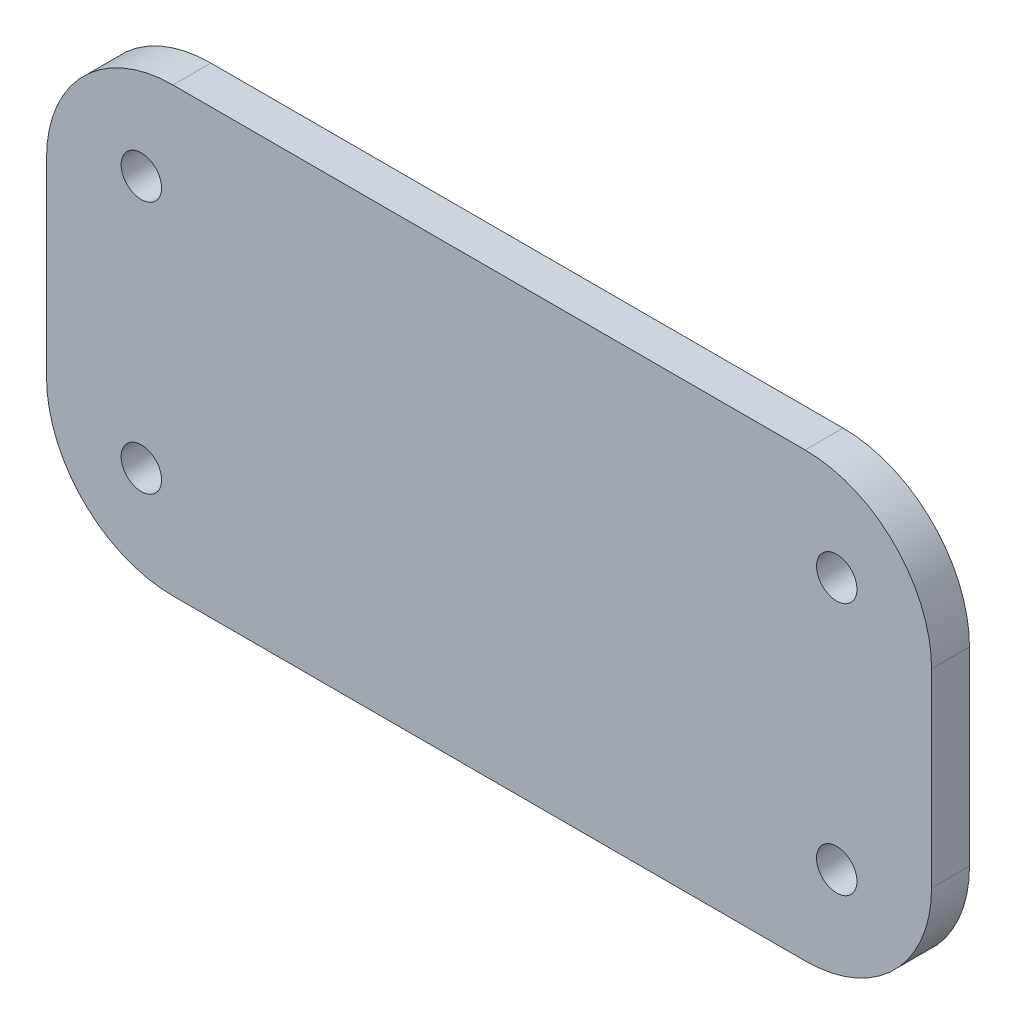
ISO-10303-21;
HEADER;
FILE_DESCRIPTION(('STEP AP214'),'2;1');
FILE_NAME('part.step','',(''),(''),'','','');
FILE_SCHEMA(('AUTOMOTIVE_DESIGN { 1 0 10303 214 1 1 1 1 }'));
ENDSEC;
DATA;
#1=APPLICATION_CONTEXT('core data for automotive mechanical design processes');
#2=APPLICATION_PROTOCOL_DEFINITION('international standard','automotive_design',2000,#1);
#3=PRODUCT_CONTEXT('',#1,'mechanical');
#4=PRODUCT('Part','Part','',(#3));
#5=PRODUCT_RELATED_PRODUCT_CATEGORY('part','',(#4));
#6=PRODUCT_DEFINITION_FORMATION('','',#4);
#7=PRODUCT_DEFINITION_CONTEXT('part definition',#1,'design');
#8=PRODUCT_DEFINITION('design','',#6,#7);
#9=PRODUCT_DEFINITION_SHAPE('','',#8);
#10=(LENGTH_UNIT() NAMED_UNIT(*) SI_UNIT(.MILLI.,.METRE.));
#11=(NAMED_UNIT(*) PLANE_ANGLE_UNIT() SI_UNIT($,.RADIAN.));
#12=(NAMED_UNIT(*) SI_UNIT($,.STERADIAN.) SOLID_ANGLE_UNIT());
#13=UNCERTAINTY_MEASURE_WITH_UNIT(LENGTH_MEASURE(1.E-05),#10,'distance_accuracy_value','');
#14=(GEOMETRIC_REPRESENTATION_CONTEXT(3) GLOBAL_UNCERTAINTY_ASSIGNED_CONTEXT((#13)) GLOBAL_UNIT_ASSIGNED_CONTEXT((#10,
#11,#12)) REPRESENTATION_CONTEXT('',''));
#15=CARTESIAN_POINT('',(0.,0.,0.));
#16=DIRECTION('',(0.,0.,1.));
#17=DIRECTION('',(1.,0.,0.));
#18=AXIS2_PLACEMENT_3D('',#15,#16,#17);
#19=CARTESIAN_POINT('',(0.,0.,3.));
#20=DIRECTION('',(0.,0.,-1.));
#21=DIRECTION('',(-1.,0.,0.));
#22=AXIS2_PLACEMENT_3D('',#19,#20,#21);
#23=PLANE('',#22);
#24=DIRECTION('',(1.,0.,0.));
#25=VECTOR('',#24,1.);
#26=CARTESIAN_POINT('',(-35.,-17.5,3.));
#27=LINE('',#26,#25);
#28=CARTESIAN_POINT('',(-25.,-17.5,3.));
#29=VERTEX_POINT('',#28);
#30=CARTESIAN_POINT('',(25.,-17.5,3.));
#31=VERTEX_POINT('',#30);
#32=EDGE_CURVE('E155',#29,#31,#27,.T.);
#33=ORIENTED_EDGE('',*,*,#32,.T.);
#34=CARTESIAN_POINT('',(25.,-7.5,3.));
#35=DIRECTION('',(0.,0.,-1.));
#36=DIRECTION('',(-1.,0.,0.));
#37=AXIS2_PLACEMENT_3D('',#34,#35,#36);
#38=CIRCLE('',#37,10.);
#39=CARTESIAN_POINT('',(35.,-7.5,3.));
#40=VERTEX_POINT('',#39);
#41=EDGE_CURVE('E184',#31,#40,#38,.F.);
#42=ORIENTED_EDGE('',*,*,#41,.T.);
#43=DIRECTION('',(0.,1.,0.));
#44=VECTOR('',#43,1.);
#45=CARTESIAN_POINT('',(35.,-17.5,3.));
#46=LINE('',#45,#44);
#47=CARTESIAN_POINT('',(35.,7.5,3.));
#48=VERTEX_POINT('',#47);
#49=EDGE_CURVE('E133',#40,#48,#46,.T.);
#50=ORIENTED_EDGE('',*,*,#49,.T.);
#51=CARTESIAN_POINT('',(25.,7.5,3.));
#52=DIRECTION('',(0.,0.,-1.));
#53=DIRECTION('',(-1.,0.,0.));
#54=AXIS2_PLACEMENT_3D('',#51,#52,#53);
#55=CIRCLE('',#54,10.);
#56=CARTESIAN_POINT('',(25.,17.5,3.));
#57=VERTEX_POINT('',#56);
#58=EDGE_CURVE('E178',#48,#57,#55,.F.);
#59=ORIENTED_EDGE('',*,*,#58,.T.);
#60=DIRECTION('',(-1.,0.,0.));
#61=VECTOR('',#60,1.);
#62=CARTESIAN_POINT('',(-35.,17.5,3.));
#63=LINE('',#62,#61);
#64=CARTESIAN_POINT('',(-25.,17.5,3.));
#65=VERTEX_POINT('',#64);
#66=EDGE_CURVE('E197',#57,#65,#63,.T.);
#67=ORIENTED_EDGE('',*,*,#66,.T.);
#68=CARTESIAN_POINT('',(-25.,7.5,3.));
#69=DIRECTION('',(0.,0.,-1.));
#70=DIRECTION('',(-1.,0.,0.));
#71=AXIS2_PLACEMENT_3D('',#68,#69,#70);
#72=CIRCLE('',#71,10.);
#73=CARTESIAN_POINT('',(-35.,7.5,3.));
#74=VERTEX_POINT('',#73);
#75=EDGE_CURVE('E67',#65,#74,#72,.F.);
#76=ORIENTED_EDGE('',*,*,#75,.T.);
#77=DIRECTION('',(0.,-1.,0.));
#78=VECTOR('',#77,1.);
#79=CARTESIAN_POINT('',(-35.,-17.5,3.));
#80=LINE('',#79,#78);
#81=CARTESIAN_POINT('',(-35.,-7.5,3.));
#82=VERTEX_POINT('',#81);
#83=EDGE_CURVE('E204',#74,#82,#80,.T.);
#84=ORIENTED_EDGE('',*,*,#83,.T.);
#85=CARTESIAN_POINT('',(-25.,-7.5,3.));
#86=DIRECTION('',(0.,0.,-1.));
#87=DIRECTION('',(-1.,0.,0.));
#88=AXIS2_PLACEMENT_3D('',#85,#86,#87);
#89=CIRCLE('',#88,10.);
#90=EDGE_CURVE('E181',#82,#29,#89,.F.);
#91=ORIENTED_EDGE('',*,*,#90,.T.);
#92=EDGE_LOOP('',(#33,#42,#50,#59,#67,#76,#84,#91));
#93=FACE_BOUND('',#92,.T.);
#94=CARTESIAN_POINT('',(-27.5,10.,3.));
#95=DIRECTION('',(0.,0.,1.));
#96=DIRECTION('',(1.,0.,0.));
#97=AXIS2_PLACEMENT_3D('',#94,#95,#96);
#98=CIRCLE('',#97,1.6);
#99=CARTESIAN_POINT('',(-25.9,10.,3.));
#100=VERTEX_POINT('',#99);
#101=EDGE_CURVE('E144',#100,#100,#98,.T.);
#102=ORIENTED_EDGE('',*,*,#101,.F.);
#103=EDGE_LOOP('',(#102));
#104=FACE_BOUND('',#103,.T.);
#105=CARTESIAN_POINT('',(-27.5,-10.,3.));
#106=DIRECTION('',(0.,0.,1.));
#107=DIRECTION('',(1.,0.,0.));
#108=AXIS2_PLACEMENT_3D('',#105,#106,#107);
#109=CIRCLE('',#108,1.6);
#110=CARTESIAN_POINT('',(-25.9,-10.,3.));
#111=VERTEX_POINT('',#110);
#112=EDGE_CURVE('E223',#111,#111,#109,.T.);
#113=ORIENTED_EDGE('',*,*,#112,.F.);
#114=EDGE_LOOP('',(#113));
#115=FACE_BOUND('',#114,.T.);
#116=CARTESIAN_POINT('',(27.5,-10.,3.));
#117=DIRECTION('',(0.,0.,1.));
#118=DIRECTION('',(1.,0.,0.));
#119=AXIS2_PLACEMENT_3D('',#116,#117,#118);
#120=CIRCLE('',#119,1.6);
#121=CARTESIAN_POINT('',(29.1,-10.,3.));
#122=VERTEX_POINT('',#121);
#123=EDGE_CURVE('E229',#122,#122,#120,.T.);
#124=ORIENTED_EDGE('',*,*,#123,.F.);
#125=EDGE_LOOP('',(#124));
#126=FACE_BOUND('',#125,.T.);
#127=CARTESIAN_POINT('',(27.5,10.,3.));
#128=DIRECTION('',(0.,0.,1.));
#129=DIRECTION('',(1.,0.,0.));
#130=AXIS2_PLACEMENT_3D('',#127,#128,#129);
#131=CIRCLE('',#130,1.6);
#132=CARTESIAN_POINT('',(29.1,10.,3.));
#133=VERTEX_POINT('',#132);
#134=EDGE_CURVE('E237',#133,#133,#131,.T.);
#135=ORIENTED_EDGE('',*,*,#134,.F.);
#136=EDGE_LOOP('',(#135));
#137=FACE_BOUND('',#136,.T.);
#138=ADVANCED_FACE('F44',(#93,#104,#115,#126,#137),#23,.F.);
#139=CARTESIAN_POINT('',(0.,0.,0.));
#140=DIRECTION('',(0.,0.,-1.));
#141=DIRECTION('',(-1.,0.,0.));
#142=AXIS2_PLACEMENT_3D('',#139,#140,#141);
#143=PLANE('',#142);
#144=CARTESIAN_POINT('',(27.5,-10.,0.));
#145=DIRECTION('',(0.,0.,1.));
#146=DIRECTION('',(1.,0.,0.));
#147=AXIS2_PLACEMENT_3D('',#144,#145,#146);
#148=CIRCLE('',#147,1.6);
#149=CARTESIAN_POINT('',(29.1,-10.,0.));
#150=VERTEX_POINT('',#149);
#151=EDGE_CURVE('E233',#150,#150,#148,.T.);
#152=ORIENTED_EDGE('',*,*,#151,.T.);
#153=EDGE_LOOP('',(#152));
#154=FACE_BOUND('',#153,.T.);
#155=CARTESIAN_POINT('',(-27.5,10.,0.));
#156=DIRECTION('',(0.,0.,1.));
#157=DIRECTION('',(1.,0.,0.));
#158=AXIS2_PLACEMENT_3D('',#155,#156,#157);
#159=CIRCLE('',#158,1.6);
#160=CARTESIAN_POINT('',(-25.9,10.,0.));
#161=VERTEX_POINT('',#160);
#162=EDGE_CURVE('E152',#161,#161,#159,.T.);
#163=ORIENTED_EDGE('',*,*,#162,.T.);
#164=EDGE_LOOP('',(#163));
#165=FACE_BOUND('',#164,.T.);
#166=DIRECTION('',(0.,1.,0.));
#167=VECTOR('',#166,1.);
#168=CARTESIAN_POINT('',(35.,-17.5,0.));
#169=LINE('',#168,#167);
#170=CARTESIAN_POINT('',(35.,-7.5,0.));
#171=VERTEX_POINT('',#170);
#172=CARTESIAN_POINT('',(35.,7.5,0.));
#173=VERTEX_POINT('',#172);
#174=EDGE_CURVE('E130',#171,#173,#169,.T.);
#175=ORIENTED_EDGE('',*,*,#174,.F.);
#176=CARTESIAN_POINT('',(25.,-7.5,0.));
#177=DIRECTION('',(0.,0.,-1.));
#178=DIRECTION('',(-1.,0.,0.));
#179=AXIS2_PLACEMENT_3D('',#176,#177,#178);
#180=CIRCLE('',#179,10.);
#181=CARTESIAN_POINT('',(25.,-17.5,0.));
#182=VERTEX_POINT('',#181);
#183=EDGE_CURVE('E112',#171,#182,#180,.T.);
#184=ORIENTED_EDGE('',*,*,#183,.T.);
#185=DIRECTION('',(1.,0.,0.));
#186=VECTOR('',#185,1.);
#187=CARTESIAN_POINT('',(-35.,-17.5,0.));
#188=LINE('',#187,#186);
#189=CARTESIAN_POINT('',(-25.,-17.5,0.));
#190=VERTEX_POINT('',#189);
#191=EDGE_CURVE('E160',#190,#182,#188,.T.);
#192=ORIENTED_EDGE('',*,*,#191,.F.);
#193=CARTESIAN_POINT('',(-25.,-7.5,0.));
#194=DIRECTION('',(0.,0.,-1.));
#195=DIRECTION('',(-1.,0.,0.));
#196=AXIS2_PLACEMENT_3D('',#193,#194,#195);
#197=CIRCLE('',#196,10.);
#198=CARTESIAN_POINT('',(-35.,-7.5,0.));
#199=VERTEX_POINT('',#198);
#200=EDGE_CURVE('E124',#190,#199,#197,.T.);
#201=ORIENTED_EDGE('',*,*,#200,.T.);
#202=DIRECTION('',(0.,-1.,0.));
#203=VECTOR('',#202,1.);
#204=CARTESIAN_POINT('',(-35.,-17.5,0.));
#205=LINE('',#204,#203);
#206=CARTESIAN_POINT('',(-35.,7.5,0.));
#207=VERTEX_POINT('',#206);
#208=EDGE_CURVE('E149',#207,#199,#205,.T.);
#209=ORIENTED_EDGE('',*,*,#208,.F.);
#210=CARTESIAN_POINT('',(-25.,7.5,0.));
#211=DIRECTION('',(0.,0.,-1.));
#212=DIRECTION('',(-1.,0.,0.));
#213=AXIS2_PLACEMENT_3D('',#210,#211,#212);
#214=CIRCLE('',#213,10.);
#215=CARTESIAN_POINT('',(-25.,17.5,0.));
#216=VERTEX_POINT('',#215);
#217=EDGE_CURVE('E135',#207,#216,#214,.T.);
#218=ORIENTED_EDGE('',*,*,#217,.T.);
#219=DIRECTION('',(-1.,0.,0.));
#220=VECTOR('',#219,1.);
#221=CARTESIAN_POINT('',(-35.,17.5,0.));
#222=LINE('',#221,#220);
#223=CARTESIAN_POINT('',(25.,17.5,0.));
#224=VERTEX_POINT('',#223);
#225=EDGE_CURVE('E143',#224,#216,#222,.T.);
#226=ORIENTED_EDGE('',*,*,#225,.F.);
#227=CARTESIAN_POINT('',(25.,7.5,0.));
#228=DIRECTION('',(0.,0.,-1.));
#229=DIRECTION('',(-1.,0.,0.));
#230=AXIS2_PLACEMENT_3D('',#227,#228,#229);
#231=CIRCLE('',#230,10.);
#232=EDGE_CURVE('E141',#224,#173,#231,.T.);
#233=ORIENTED_EDGE('',*,*,#232,.T.);
#234=EDGE_LOOP('',(#175,#184,#192,#201,#209,#218,#226,#233));
#235=FACE_BOUND('',#234,.T.);
#236=CARTESIAN_POINT('',(-27.5,-10.,0.));
#237=DIRECTION('',(0.,0.,1.));
#238=DIRECTION('',(1.,0.,0.));
#239=AXIS2_PLACEMENT_3D('',#236,#237,#238);
#240=CIRCLE('',#239,1.6);
#241=CARTESIAN_POINT('',(-25.9,-10.,0.));
#242=VERTEX_POINT('',#241);
#243=EDGE_CURVE('E225',#242,#242,#240,.T.);
#244=ORIENTED_EDGE('',*,*,#243,.T.);
#245=EDGE_LOOP('',(#244));
#246=FACE_BOUND('',#245,.T.);
#247=CARTESIAN_POINT('',(27.5,10.,0.));
#248=DIRECTION('',(0.,0.,1.));
#249=DIRECTION('',(1.,0.,0.));
#250=AXIS2_PLACEMENT_3D('',#247,#248,#249);
#251=CIRCLE('',#250,1.6);
#252=CARTESIAN_POINT('',(29.1,10.,0.));
#253=VERTEX_POINT('',#252);
#254=EDGE_CURVE('E241',#253,#253,#251,.T.);
#255=ORIENTED_EDGE('',*,*,#254,.T.);
#256=EDGE_LOOP('',(#255));
#257=FACE_BOUND('',#256,.T.);
#258=ADVANCED_FACE('F138',(#154,#165,#235,#246,#257),#143,.T.);
#259=CARTESIAN_POINT('',(35.,-17.5,3.));
#260=DIRECTION('',(-1.,0.,0.));
#261=DIRECTION('',(0.,-1.,0.));
#262=AXIS2_PLACEMENT_3D('',#259,#260,#261);
#263=PLANE('',#262);
#264=ORIENTED_EDGE('',*,*,#49,.F.);
#265=DIRECTION('',(0.,0.,-1.));
#266=VECTOR('',#265,1.);
#267=CARTESIAN_POINT('',(35.,-7.5,3.));
#268=LINE('',#267,#266);
#269=EDGE_CURVE('E116',#40,#171,#268,.T.);
#270=ORIENTED_EDGE('',*,*,#269,.T.);
#271=ORIENTED_EDGE('',*,*,#174,.T.);
#272=DIRECTION('',(0.,0.,-1.));
#273=VECTOR('',#272,1.);
#274=CARTESIAN_POINT('',(35.,7.5,3.));
#275=LINE('',#274,#273);
#276=EDGE_CURVE('E136',#173,#48,#275,.F.);
#277=ORIENTED_EDGE('',*,*,#276,.T.);
#278=EDGE_LOOP('',(#264,#270,#271,#277));
#279=FACE_BOUND('',#278,.T.);
#280=ADVANCED_FACE('F129',(#279),#263,.F.);
#281=CARTESIAN_POINT('',(-35.,17.5,3.));
#282=DIRECTION('',(0.,-1.,0.));
#283=DIRECTION('',(1.,0.,0.));
#284=AXIS2_PLACEMENT_3D('',#281,#282,#283);
#285=PLANE('',#284);
#286=ORIENTED_EDGE('',*,*,#66,.F.);
#287=DIRECTION('',(0.,0.,-1.));
#288=VECTOR('',#287,1.);
#289=CARTESIAN_POINT('',(25.,17.5,3.));
#290=LINE('',#289,#288);
#291=EDGE_CURVE('E11',#57,#224,#290,.T.);
#292=ORIENTED_EDGE('',*,*,#291,.T.);
#293=ORIENTED_EDGE('',*,*,#225,.T.);
#294=DIRECTION('',(0.,0.,-1.));
#295=VECTOR('',#294,1.);
#296=CARTESIAN_POINT('',(-25.,17.5,3.));
#297=LINE('',#296,#295);
#298=EDGE_CURVE('E53',#216,#65,#297,.F.);
#299=ORIENTED_EDGE('',*,*,#298,.T.);
#300=EDGE_LOOP('',(#286,#292,#293,#299));
#301=FACE_BOUND('',#300,.T.);
#302=ADVANCED_FACE('F196',(#301),#285,.F.);
#303=CARTESIAN_POINT('',(-35.,-17.5,3.));
#304=DIRECTION('',(1.,0.,0.));
#305=DIRECTION('',(0.,0.,-1.));
#306=AXIS2_PLACEMENT_3D('',#303,#304,#305);
#307=PLANE('',#306);
#308=ORIENTED_EDGE('',*,*,#208,.T.);
#309=DIRECTION('',(0.,0.,-1.));
#310=VECTOR('',#309,1.);
#311=CARTESIAN_POINT('',(-35.,-7.5,3.));
#312=LINE('',#311,#310);
#313=EDGE_CURVE('E60',#199,#82,#312,.F.);
#314=ORIENTED_EDGE('',*,*,#313,.T.);
#315=ORIENTED_EDGE('',*,*,#83,.F.);
#316=DIRECTION('',(0.,0.,-1.));
#317=VECTOR('',#316,1.);
#318=CARTESIAN_POINT('',(-35.,7.5,3.));
#319=LINE('',#318,#317);
#320=EDGE_CURVE('E187',#74,#207,#319,.T.);
#321=ORIENTED_EDGE('',*,*,#320,.T.);
#322=EDGE_LOOP('',(#308,#314,#315,#321));
#323=FACE_BOUND('',#322,.T.);
#324=ADVANCED_FACE('F208',(#323),#307,.F.);
#325=CARTESIAN_POINT('',(-35.,-17.5,3.));
#326=DIRECTION('',(0.,1.,0.));
#327=DIRECTION('',(0.,0.,1.));
#328=AXIS2_PLACEMENT_3D('',#325,#326,#327);
#329=PLANE('',#328);
#330=ORIENTED_EDGE('',*,*,#191,.T.);
#331=DIRECTION('',(0.,0.,-1.));
#332=VECTOR('',#331,1.);
#333=CARTESIAN_POINT('',(25.,-17.5,3.));
#334=LINE('',#333,#332);
#335=EDGE_CURVE('E117',#182,#31,#334,.F.);
#336=ORIENTED_EDGE('',*,*,#335,.T.);
#337=ORIENTED_EDGE('',*,*,#32,.F.);
#338=DIRECTION('',(0.,0.,-1.));
#339=VECTOR('',#338,1.);
#340=CARTESIAN_POINT('',(-25.,-17.5,3.));
#341=LINE('',#340,#339);
#342=EDGE_CURVE('E123',#29,#190,#341,.T.);
#343=ORIENTED_EDGE('',*,*,#342,.T.);
#344=EDGE_LOOP('',(#330,#336,#337,#343));
#345=FACE_BOUND('',#344,.T.);
#346=ADVANCED_FACE('F215',(#345),#329,.F.);
#347=CARTESIAN_POINT('',(-27.5,10.,3.));
#348=DIRECTION('',(0.,0.,-1.));
#349=DIRECTION('',(-1.,0.,0.));
#350=AXIS2_PLACEMENT_3D('',#347,#348,#349);
#351=CYLINDRICAL_SURFACE('',#350,1.6);
#352=ORIENTED_EDGE('',*,*,#101,.T.);
#353=EDGE_LOOP('',(#352));
#354=FACE_BOUND('',#353,.T.);
#355=ORIENTED_EDGE('',*,*,#162,.F.);
#356=EDGE_LOOP('',(#355));
#357=FACE_BOUND('',#356,.T.);
#358=ADVANCED_FACE('F261',(#354,#357),#351,.F.);
#359=CARTESIAN_POINT('',(-27.5,-10.,3.));
#360=DIRECTION('',(0.,0.,-1.));
#361=DIRECTION('',(-1.,0.,0.));
#362=AXIS2_PLACEMENT_3D('',#359,#360,#361);
#363=CYLINDRICAL_SURFACE('',#362,1.6);
#364=ORIENTED_EDGE('',*,*,#112,.T.);
#365=EDGE_LOOP('',(#364));
#366=FACE_BOUND('',#365,.T.);
#367=ORIENTED_EDGE('',*,*,#243,.F.);
#368=EDGE_LOOP('',(#367));
#369=FACE_BOUND('',#368,.T.);
#370=ADVANCED_FACE('F317',(#366,#369),#363,.F.);
#371=CARTESIAN_POINT('',(27.5,-10.,3.));
#372=DIRECTION('',(0.,0.,-1.));
#373=DIRECTION('',(-1.,0.,0.));
#374=AXIS2_PLACEMENT_3D('',#371,#372,#373);
#375=CYLINDRICAL_SURFACE('',#374,1.6);
#376=ORIENTED_EDGE('',*,*,#123,.T.);
#377=EDGE_LOOP('',(#376));
#378=FACE_BOUND('',#377,.T.);
#379=ORIENTED_EDGE('',*,*,#151,.F.);
#380=EDGE_LOOP('',(#379));
#381=FACE_BOUND('',#380,.T.);
#382=ADVANCED_FACE('F308',(#378,#381),#375,.F.);
#383=CARTESIAN_POINT('',(27.5,10.,3.));
#384=DIRECTION('',(0.,0.,-1.));
#385=DIRECTION('',(-1.,0.,0.));
#386=AXIS2_PLACEMENT_3D('',#383,#384,#385);
#387=CYLINDRICAL_SURFACE('',#386,1.6);
#388=ORIENTED_EDGE('',*,*,#134,.T.);
#389=EDGE_LOOP('',(#388));
#390=FACE_BOUND('',#389,.T.);
#391=ORIENTED_EDGE('',*,*,#254,.F.);
#392=EDGE_LOOP('',(#391));
#393=FACE_BOUND('',#392,.T.);
#394=ADVANCED_FACE('F249',(#390,#393),#387,.F.);
#395=CARTESIAN_POINT('',(25.,-7.5,3.));
#396=DIRECTION('',(0.,0.,-1.));
#397=DIRECTION('',(-1.,0.,0.));
#398=AXIS2_PLACEMENT_3D('',#395,#396,#397);
#399=CYLINDRICAL_SURFACE('',#398,10.);
#400=ORIENTED_EDGE('',*,*,#41,.F.);
#401=ORIENTED_EDGE('',*,*,#335,.F.);
#402=ORIENTED_EDGE('',*,*,#183,.F.);
#403=ORIENTED_EDGE('',*,*,#269,.F.);
#404=EDGE_LOOP('',(#400,#401,#402,#403));
#405=FACE_BOUND('',#404,.T.);
#406=ADVANCED_FACE('F115',(#405),#399,.T.);
#407=CARTESIAN_POINT('',(-25.,-7.5,3.));
#408=DIRECTION('',(0.,0.,-1.));
#409=DIRECTION('',(-1.,0.,0.));
#410=AXIS2_PLACEMENT_3D('',#407,#408,#409);
#411=CYLINDRICAL_SURFACE('',#410,10.);
#412=ORIENTED_EDGE('',*,*,#90,.F.);
#413=ORIENTED_EDGE('',*,*,#313,.F.);
#414=ORIENTED_EDGE('',*,*,#200,.F.);
#415=ORIENTED_EDGE('',*,*,#342,.F.);
#416=EDGE_LOOP('',(#412,#413,#414,#415));
#417=FACE_BOUND('',#416,.T.);
#418=ADVANCED_FACE('F212',(#417),#411,.T.);
#419=CARTESIAN_POINT('',(25.,7.5,3.));
#420=DIRECTION('',(0.,0.,-1.));
#421=DIRECTION('',(-1.,0.,0.));
#422=AXIS2_PLACEMENT_3D('',#419,#420,#421);
#423=CYLINDRICAL_SURFACE('',#422,10.);
#424=ORIENTED_EDGE('',*,*,#58,.F.);
#425=ORIENTED_EDGE('',*,*,#276,.F.);
#426=ORIENTED_EDGE('',*,*,#232,.F.);
#427=ORIENTED_EDGE('',*,*,#291,.F.);
#428=EDGE_LOOP('',(#424,#425,#426,#427));
#429=FACE_BOUND('',#428,.T.);
#430=ADVANCED_FACE('F275',(#429),#423,.T.);
#431=CARTESIAN_POINT('',(-25.,7.5,3.));
#432=DIRECTION('',(0.,0.,-1.));
#433=DIRECTION('',(-1.,0.,0.));
#434=AXIS2_PLACEMENT_3D('',#431,#432,#433);
#435=CYLINDRICAL_SURFACE('',#434,10.);
#436=ORIENTED_EDGE('',*,*,#75,.F.);
#437=ORIENTED_EDGE('',*,*,#298,.F.);
#438=ORIENTED_EDGE('',*,*,#217,.F.);
#439=ORIENTED_EDGE('',*,*,#320,.F.);
#440=EDGE_LOOP('',(#436,#437,#438,#439));
#441=FACE_BOUND('',#440,.T.);
#442=ADVANCED_FACE('F46',(#441),#435,.T.);
#443=CLOSED_SHELL('',(#138,#258,#280,#302,#324,#346,#358,#370,#382,#394,#406,#418,#430,#442));
#444=MANIFOLD_SOLID_BREP('B2',#443);
#445=ADVANCED_BREP_SHAPE_REPRESENTATION('',(#18,#444),#14);
#446=SHAPE_DEFINITION_REPRESENTATION(#9,#445);
ENDSEC;
END-ISO-10303-21;
